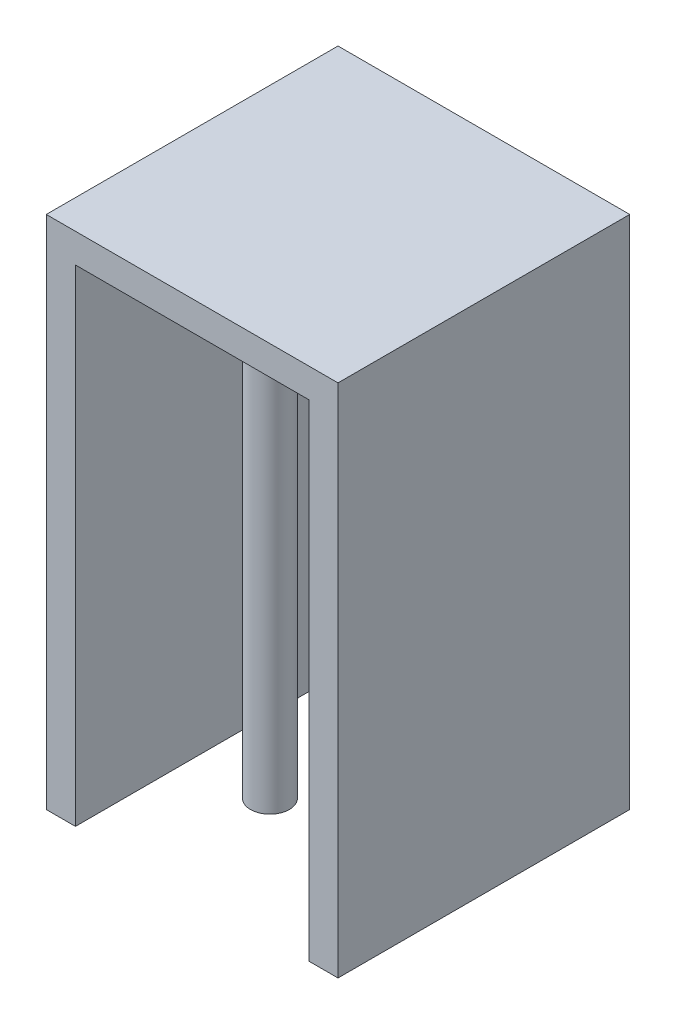
ISO-10303-21;
HEADER;
FILE_DESCRIPTION(('STEP AP214'),'2;1');
FILE_NAME('part.step','',(''),(''),'','','');
FILE_SCHEMA(('AUTOMOTIVE_DESIGN { 1 0 10303 214 1 1 1 1 }'));
ENDSEC;
DATA;
#1=APPLICATION_CONTEXT('core data for automotive mechanical design processes');
#2=APPLICATION_PROTOCOL_DEFINITION('international standard','automotive_design',2000,#1);
#3=PRODUCT_CONTEXT('',#1,'mechanical');
#4=PRODUCT('Part','Part','',(#3));
#5=PRODUCT_RELATED_PRODUCT_CATEGORY('part','',(#4));
#6=PRODUCT_DEFINITION_FORMATION('','',#4);
#7=PRODUCT_DEFINITION_CONTEXT('part definition',#1,'design');
#8=PRODUCT_DEFINITION('design','',#6,#7);
#9=PRODUCT_DEFINITION_SHAPE('','',#8);
#10=(LENGTH_UNIT() NAMED_UNIT(*) SI_UNIT(.MILLI.,.METRE.));
#11=(NAMED_UNIT(*) PLANE_ANGLE_UNIT() SI_UNIT($,.RADIAN.));
#12=(NAMED_UNIT(*) SI_UNIT($,.STERADIAN.) SOLID_ANGLE_UNIT());
#13=UNCERTAINTY_MEASURE_WITH_UNIT(LENGTH_MEASURE(1.E-05),#10,'distance_accuracy_value','');
#14=(GEOMETRIC_REPRESENTATION_CONTEXT(3) GLOBAL_UNCERTAINTY_ASSIGNED_CONTEXT((#13)) GLOBAL_UNIT_ASSIGNED_CONTEXT((#10,
#11,#12)) REPRESENTATION_CONTEXT('',''));
#15=CARTESIAN_POINT('',(0.,0.,0.));
#16=DIRECTION('',(0.,0.,1.));
#17=DIRECTION('',(1.,0.,0.));
#18=AXIS2_PLACEMENT_3D('',#15,#16,#17);
#19=CARTESIAN_POINT('',(0.,-3.,0.));
#20=DIRECTION('',(0.,1.,0.));
#21=DIRECTION('',(0.,0.,1.));
#22=AXIS2_PLACEMENT_3D('',#19,#20,#21);
#23=PLANE('',#22);
#24=CARTESIAN_POINT('',(7.,-3.,0.));
#25=DIRECTION('',(0.,1.,0.));
#26=DIRECTION('',(0.,0.,1.));
#27=AXIS2_PLACEMENT_3D('',#24,#25,#26);
#28=CIRCLE('',#27,2.);
#29=CARTESIAN_POINT('',(7.,-3.,2.));
#30=VERTEX_POINT('',#29);
#31=EDGE_CURVE('E11',#30,#30,#28,.F.);
#32=ORIENTED_EDGE('',*,*,#31,.F.);
#33=EDGE_LOOP('',(#32));
#34=FACE_BOUND('',#33,.T.);
#35=CARTESIAN_POINT('',(-7.,-3.,0.));
#36=DIRECTION('',(0.,1.,0.));
#37=DIRECTION('',(0.,0.,1.));
#38=AXIS2_PLACEMENT_3D('',#35,#36,#37);
#39=CIRCLE('',#38,2.);
#40=CARTESIAN_POINT('',(-7.,-3.,2.));
#41=VERTEX_POINT('',#40);
#42=EDGE_CURVE('E45',#41,#41,#39,.F.);
#43=ORIENTED_EDGE('',*,*,#42,.F.);
#44=EDGE_LOOP('',(#43));
#45=FACE_BOUND('',#44,.T.);
#46=DIRECTION('',(0.,0.,1.));
#47=VECTOR('',#46,1.);
#48=CARTESIAN_POINT('',(-12.,-3.,15.));
#49=LINE('',#48,#47);
#50=CARTESIAN_POINT('',(-12.,-3.,-12.));
#51=VERTEX_POINT('',#50);
#52=CARTESIAN_POINT('',(-12.,-3.,15.));
#53=VERTEX_POINT('',#52);
#54=EDGE_CURVE('E52',#51,#53,#49,.T.);
#55=ORIENTED_EDGE('',*,*,#54,.F.);
#56=DIRECTION('',(-1.,0.,0.));
#57=VECTOR('',#56,1.);
#58=CARTESIAN_POINT('',(-12.,-3.,-12.));
#59=LINE('',#58,#57);
#60=CARTESIAN_POINT('',(12.,-3.,-12.));
#61=VERTEX_POINT('',#60);
#62=EDGE_CURVE('E125',#61,#51,#59,.T.);
#63=ORIENTED_EDGE('',*,*,#62,.F.);
#64=DIRECTION('',(0.,0.,-1.));
#65=VECTOR('',#64,1.);
#66=CARTESIAN_POINT('',(12.,-3.,15.));
#67=LINE('',#66,#65);
#68=CARTESIAN_POINT('',(12.,-3.,15.));
#69=VERTEX_POINT('',#68);
#70=EDGE_CURVE('E57',#69,#61,#67,.T.);
#71=ORIENTED_EDGE('',*,*,#70,.F.);
#72=DIRECTION('',(1.,0.,0.));
#73=VECTOR('',#72,1.);
#74=CARTESIAN_POINT('',(15.,-3.,15.));
#75=LINE('',#74,#73);
#76=EDGE_CURVE('E155',#53,#69,#75,.T.);
#77=ORIENTED_EDGE('',*,*,#76,.F.);
#78=EDGE_LOOP('',(#55,#63,#71,#77));
#79=FACE_BOUND('',#78,.T.);
#80=ADVANCED_FACE('F37',(#34,#45,#79),#23,.F.);
#81=CARTESIAN_POINT('',(-15.,-3.,15.));
#82=DIRECTION('',(-1.,0.,0.));
#83=DIRECTION('',(0.,0.,1.));
#84=AXIS2_PLACEMENT_3D('',#81,#82,#83);
#85=PLANE('',#84);
#86=DIRECTION('',(0.,0.,1.));
#87=VECTOR('',#86,1.);
#88=CARTESIAN_POINT('',(-15.,0.,15.));
#89=LINE('',#88,#87);
#90=CARTESIAN_POINT('',(-15.,0.,-15.));
#91=VERTEX_POINT('',#90);
#92=CARTESIAN_POINT('',(-15.,0.,15.));
#93=VERTEX_POINT('',#92);
#94=EDGE_CURVE('E106',#91,#93,#89,.T.);
#95=ORIENTED_EDGE('',*,*,#94,.F.);
#96=DIRECTION('',(0.,1.,0.));
#97=VECTOR('',#96,1.);
#98=CARTESIAN_POINT('',(-15.,-3.,-15.));
#99=LINE('',#98,#97);
#100=CARTESIAN_POINT('',(-15.,-53.,-15.));
#101=VERTEX_POINT('',#100);
#102=EDGE_CURVE('E101',#101,#91,#99,.T.);
#103=ORIENTED_EDGE('',*,*,#102,.F.);
#104=DIRECTION('',(0.,0.,-1.));
#105=VECTOR('',#104,1.);
#106=CARTESIAN_POINT('',(-15.,-53.,-15.));
#107=LINE('',#106,#105);
#108=CARTESIAN_POINT('',(-15.,-53.,15.));
#109=VERTEX_POINT('',#108);
#110=EDGE_CURVE('E104',#109,#101,#107,.T.);
#111=ORIENTED_EDGE('',*,*,#110,.F.);
#112=DIRECTION('',(0.,1.,0.));
#113=VECTOR('',#112,1.);
#114=CARTESIAN_POINT('',(-15.,-3.,15.));
#115=LINE('',#114,#113);
#116=EDGE_CURVE('E157',#109,#93,#115,.T.);
#117=ORIENTED_EDGE('',*,*,#116,.T.);
#118=EDGE_LOOP('',(#95,#103,#111,#117));
#119=FACE_BOUND('',#118,.T.);
#120=ADVANCED_FACE('F39',(#119),#85,.T.);
#121=CARTESIAN_POINT('',(15.,-3.,-15.));
#122=DIRECTION('',(0.,0.,-1.));
#123=DIRECTION('',(-1.,0.,0.));
#124=AXIS2_PLACEMENT_3D('',#121,#122,#123);
#125=PLANE('',#124);
#126=DIRECTION('',(-1.,0.,0.));
#127=VECTOR('',#126,1.);
#128=CARTESIAN_POINT('',(15.,0.,-15.));
#129=LINE('',#128,#127);
#130=CARTESIAN_POINT('',(15.,0.,-15.));
#131=VERTEX_POINT('',#130);
#132=EDGE_CURVE('E158',#131,#91,#129,.T.);
#133=ORIENTED_EDGE('',*,*,#132,.F.);
#134=DIRECTION('',(0.,1.,0.));
#135=VECTOR('',#134,1.);
#136=CARTESIAN_POINT('',(15.,-3.,-15.));
#137=LINE('',#136,#135);
#138=CARTESIAN_POINT('',(15.,-53.,-15.));
#139=VERTEX_POINT('',#138);
#140=EDGE_CURVE('E110',#139,#131,#137,.T.);
#141=ORIENTED_EDGE('',*,*,#140,.F.);
#142=DIRECTION('',(1.,0.,0.));
#143=VECTOR('',#142,1.);
#144=CARTESIAN_POINT('',(-12.,-53.,-15.));
#145=LINE('',#144,#143);
#146=EDGE_CURVE('E113',#101,#139,#145,.T.);
#147=ORIENTED_EDGE('',*,*,#146,.F.);
#148=ORIENTED_EDGE('',*,*,#102,.T.);
#149=EDGE_LOOP('',(#133,#141,#147,#148));
#150=FACE_BOUND('',#149,.T.);
#151=ADVANCED_FACE('F114',(#150),#125,.T.);
#152=CARTESIAN_POINT('',(15.,-3.,15.));
#153=DIRECTION('',(1.,0.,0.));
#154=DIRECTION('',(0.,0.,-1.));
#155=AXIS2_PLACEMENT_3D('',#152,#153,#154);
#156=PLANE('',#155);
#157=DIRECTION('',(0.,0.,-1.));
#158=VECTOR('',#157,1.);
#159=CARTESIAN_POINT('',(15.,0.,15.));
#160=LINE('',#159,#158);
#161=CARTESIAN_POINT('',(15.,0.,15.));
#162=VERTEX_POINT('',#161);
#163=EDGE_CURVE('E163',#162,#131,#160,.T.);
#164=ORIENTED_EDGE('',*,*,#163,.F.);
#165=DIRECTION('',(0.,1.,0.));
#166=VECTOR('',#165,1.);
#167=CARTESIAN_POINT('',(15.,-3.,15.));
#168=LINE('',#167,#166);
#169=CARTESIAN_POINT('',(15.,-53.,15.));
#170=VERTEX_POINT('',#169);
#171=EDGE_CURVE('E168',#170,#162,#168,.T.);
#172=ORIENTED_EDGE('',*,*,#171,.F.);
#173=DIRECTION('',(0.,0.,1.));
#174=VECTOR('',#173,1.);
#175=CARTESIAN_POINT('',(15.,-53.,-15.));
#176=LINE('',#175,#174);
#177=EDGE_CURVE('E118',#139,#170,#176,.T.);
#178=ORIENTED_EDGE('',*,*,#177,.F.);
#179=ORIENTED_EDGE('',*,*,#140,.T.);
#180=EDGE_LOOP('',(#164,#172,#178,#179));
#181=FACE_BOUND('',#180,.T.);
#182=ADVANCED_FACE('F195',(#181),#156,.T.);
#183=CARTESIAN_POINT('',(15.,-3.,15.));
#184=DIRECTION('',(0.,0.,1.));
#185=DIRECTION('',(1.,0.,0.));
#186=AXIS2_PLACEMENT_3D('',#183,#184,#185);
#187=PLANE('',#186);
#188=DIRECTION('',(1.,0.,0.));
#189=VECTOR('',#188,1.);
#190=CARTESIAN_POINT('',(15.,0.,15.));
#191=LINE('',#190,#189);
#192=EDGE_CURVE('E160',#93,#162,#191,.T.);
#193=ORIENTED_EDGE('',*,*,#192,.F.);
#194=ORIENTED_EDGE('',*,*,#116,.F.);
#195=DIRECTION('',(-1.,0.,0.));
#196=VECTOR('',#195,1.);
#197=CARTESIAN_POINT('',(-15.,-53.,15.));
#198=LINE('',#197,#196);
#199=CARTESIAN_POINT('',(-12.,-53.,15.));
#200=VERTEX_POINT('',#199);
#201=EDGE_CURVE('E123',#200,#109,#198,.T.);
#202=ORIENTED_EDGE('',*,*,#201,.F.);
#203=DIRECTION('',(0.,1.,0.));
#204=VECTOR('',#203,1.);
#205=CARTESIAN_POINT('',(-12.,-53.,15.));
#206=LINE('',#205,#204);
#207=EDGE_CURVE('E141',#200,#53,#206,.T.);
#208=ORIENTED_EDGE('',*,*,#207,.T.);
#209=ORIENTED_EDGE('',*,*,#76,.T.);
#210=DIRECTION('',(0.,1.,0.));
#211=VECTOR('',#210,1.);
#212=CARTESIAN_POINT('',(12.,-53.,15.));
#213=LINE('',#212,#211);
#214=CARTESIAN_POINT('',(12.,-53.,15.));
#215=VERTEX_POINT('',#214);
#216=EDGE_CURVE('E152',#215,#69,#213,.T.);
#217=ORIENTED_EDGE('',*,*,#216,.F.);
#218=DIRECTION('',(-1.,0.,0.));
#219=VECTOR('',#218,1.);
#220=CARTESIAN_POINT('',(15.,-53.,15.));
#221=LINE('',#220,#219);
#222=EDGE_CURVE('E132',#170,#215,#221,.T.);
#223=ORIENTED_EDGE('',*,*,#222,.F.);
#224=ORIENTED_EDGE('',*,*,#171,.T.);
#225=EDGE_LOOP('',(#193,#194,#202,#208,#209,#217,#223,#224));
#226=FACE_BOUND('',#225,.T.);
#227=ADVANCED_FACE('F191',(#226),#187,.T.);
#228=CARTESIAN_POINT('',(0.,0.,0.));
#229=DIRECTION('',(0.,1.,0.));
#230=DIRECTION('',(0.,0.,1.));
#231=AXIS2_PLACEMENT_3D('',#228,#229,#230);
#232=PLANE('',#231);
#233=ORIENTED_EDGE('',*,*,#94,.T.);
#234=ORIENTED_EDGE('',*,*,#192,.T.);
#235=ORIENTED_EDGE('',*,*,#163,.T.);
#236=ORIENTED_EDGE('',*,*,#132,.T.);
#237=EDGE_LOOP('',(#233,#234,#235,#236));
#238=FACE_BOUND('',#237,.T.);
#239=ADVANCED_FACE('F188',(#238),#232,.T.);
#240=CARTESIAN_POINT('',(12.,-53.,15.));
#241=DIRECTION('',(1.,0.,0.));
#242=DIRECTION('',(0.,0.,-1.));
#243=AXIS2_PLACEMENT_3D('',#240,#241,#242);
#244=PLANE('',#243);
#245=ORIENTED_EDGE('',*,*,#70,.T.);
#246=DIRECTION('',(0.,1.,0.));
#247=VECTOR('',#246,1.);
#248=CARTESIAN_POINT('',(12.,-53.,-12.));
#249=LINE('',#248,#247);
#250=CARTESIAN_POINT('',(12.,-53.,-12.));
#251=VERTEX_POINT('',#250);
#252=EDGE_CURVE('E149',#251,#61,#249,.T.);
#253=ORIENTED_EDGE('',*,*,#252,.F.);
#254=DIRECTION('',(0.,0.,-1.));
#255=VECTOR('',#254,1.);
#256=CARTESIAN_POINT('',(12.,-53.,15.));
#257=LINE('',#256,#255);
#258=EDGE_CURVE('E134',#215,#251,#257,.T.);
#259=ORIENTED_EDGE('',*,*,#258,.F.);
#260=ORIENTED_EDGE('',*,*,#216,.T.);
#261=EDGE_LOOP('',(#245,#253,#259,#260));
#262=FACE_BOUND('',#261,.T.);
#263=ADVANCED_FACE('F186',(#262),#244,.F.);
#264=CARTESIAN_POINT('',(-12.,-53.,-12.));
#265=DIRECTION('',(0.,0.,-1.));
#266=DIRECTION('',(-1.,0.,0.));
#267=AXIS2_PLACEMENT_3D('',#264,#265,#266);
#268=PLANE('',#267);
#269=ORIENTED_EDGE('',*,*,#62,.T.);
#270=DIRECTION('',(0.,1.,0.));
#271=VECTOR('',#270,1.);
#272=CARTESIAN_POINT('',(-12.,-53.,-12.));
#273=LINE('',#272,#271);
#274=CARTESIAN_POINT('',(-12.,-53.,-12.));
#275=VERTEX_POINT('',#274);
#276=EDGE_CURVE('E146',#275,#51,#273,.T.);
#277=ORIENTED_EDGE('',*,*,#276,.F.);
#278=DIRECTION('',(-1.,0.,0.));
#279=VECTOR('',#278,1.);
#280=CARTESIAN_POINT('',(-12.,-53.,-12.));
#281=LINE('',#280,#279);
#282=EDGE_CURVE('E136',#251,#275,#281,.T.);
#283=ORIENTED_EDGE('',*,*,#282,.F.);
#284=ORIENTED_EDGE('',*,*,#252,.T.);
#285=EDGE_LOOP('',(#269,#277,#283,#284));
#286=FACE_BOUND('',#285,.T.);
#287=ADVANCED_FACE('F214',(#286),#268,.F.);
#288=CARTESIAN_POINT('',(-12.,-53.,15.));
#289=DIRECTION('',(-1.,0.,0.));
#290=DIRECTION('',(0.,0.,1.));
#291=AXIS2_PLACEMENT_3D('',#288,#289,#290);
#292=PLANE('',#291);
#293=ORIENTED_EDGE('',*,*,#54,.T.);
#294=ORIENTED_EDGE('',*,*,#207,.F.);
#295=DIRECTION('',(0.,0.,1.));
#296=VECTOR('',#295,1.);
#297=CARTESIAN_POINT('',(-12.,-53.,15.));
#298=LINE('',#297,#296);
#299=EDGE_CURVE('E138',#275,#200,#298,.T.);
#300=ORIENTED_EDGE('',*,*,#299,.F.);
#301=ORIENTED_EDGE('',*,*,#276,.T.);
#302=EDGE_LOOP('',(#293,#294,#300,#301));
#303=FACE_BOUND('',#302,.T.);
#304=ADVANCED_FACE('F216',(#303),#292,.F.);
#305=CARTESIAN_POINT('',(0.,-53.,0.));
#306=DIRECTION('',(0.,1.,0.));
#307=DIRECTION('',(0.,0.,1.));
#308=AXIS2_PLACEMENT_3D('',#305,#306,#307);
#309=PLANE('',#308);
#310=ORIENTED_EDGE('',*,*,#110,.T.);
#311=ORIENTED_EDGE('',*,*,#146,.T.);
#312=ORIENTED_EDGE('',*,*,#177,.T.);
#313=ORIENTED_EDGE('',*,*,#222,.T.);
#314=ORIENTED_EDGE('',*,*,#258,.T.);
#315=ORIENTED_EDGE('',*,*,#282,.T.);
#316=ORIENTED_EDGE('',*,*,#299,.T.);
#317=ORIENTED_EDGE('',*,*,#201,.T.);
#318=EDGE_LOOP('',(#310,#311,#312,#313,#314,#315,#316,#317));
#319=FACE_BOUND('',#318,.T.);
#320=ADVANCED_FACE('F121',(#319),#309,.F.);
#321=CARTESIAN_POINT('',(-7.,-55.5,0.));
#322=DIRECTION('',(0.,1.,0.));
#323=DIRECTION('',(0.,0.,1.));
#324=AXIS2_PLACEMENT_3D('',#321,#322,#323);
#325=CYLINDRICAL_SURFACE('',#324,2.);
#326=CARTESIAN_POINT('',(-7.,-55.5,0.));
#327=DIRECTION('',(0.,-1.,0.));
#328=DIRECTION('',(0.,0.,-1.));
#329=AXIS2_PLACEMENT_3D('',#326,#327,#328);
#330=CIRCLE('',#329,2.);
#331=CARTESIAN_POINT('',(-7.,-55.5,-2.));
#332=VERTEX_POINT('',#331);
#333=EDGE_CURVE('E128',#332,#332,#330,.T.);
#334=ORIENTED_EDGE('',*,*,#333,.F.);
#335=EDGE_LOOP('',(#334));
#336=FACE_BOUND('',#335,.T.);
#337=ORIENTED_EDGE('',*,*,#42,.T.);
#338=EDGE_LOOP('',(#337));
#339=FACE_BOUND('',#338,.T.);
#340=ADVANCED_FACE('F173',(#336,#339),#325,.T.);
#341=CARTESIAN_POINT('',(-7.,-55.5,0.));
#342=DIRECTION('',(0.,-1.,0.));
#343=DIRECTION('',(0.,0.,-1.));
#344=AXIS2_PLACEMENT_3D('',#341,#342,#343);
#345=PLANE('',#344);
#346=ORIENTED_EDGE('',*,*,#333,.T.);
#347=EDGE_LOOP('',(#346));
#348=FACE_BOUND('',#347,.T.);
#349=ADVANCED_FACE('F227',(#348),#345,.T.);
#350=CARTESIAN_POINT('',(7.,-55.5,0.));
#351=DIRECTION('',(0.,1.,0.));
#352=DIRECTION('',(0.,0.,1.));
#353=AXIS2_PLACEMENT_3D('',#350,#351,#352);
#354=CYLINDRICAL_SURFACE('',#353,2.);
#355=CARTESIAN_POINT('',(7.,-55.5,0.));
#356=DIRECTION('',(0.,-1.,0.));
#357=DIRECTION('',(0.,0.,-1.));
#358=AXIS2_PLACEMENT_3D('',#355,#356,#357);
#359=CIRCLE('',#358,2.);
#360=CARTESIAN_POINT('',(7.,-55.5,-2.));
#361=VERTEX_POINT('',#360);
#362=EDGE_CURVE('E243',#361,#361,#359,.T.);
#363=ORIENTED_EDGE('',*,*,#362,.F.);
#364=EDGE_LOOP('',(#363));
#365=FACE_BOUND('',#364,.T.);
#366=ORIENTED_EDGE('',*,*,#31,.T.);
#367=EDGE_LOOP('',(#366));
#368=FACE_BOUND('',#367,.T.);
#369=ADVANCED_FACE('F231',(#365,#368),#354,.T.);
#370=CARTESIAN_POINT('',(7.,-55.5,0.));
#371=DIRECTION('',(0.,-1.,0.));
#372=DIRECTION('',(0.,0.,-1.));
#373=AXIS2_PLACEMENT_3D('',#370,#371,#372);
#374=PLANE('',#373);
#375=ORIENTED_EDGE('',*,*,#362,.T.);
#376=EDGE_LOOP('',(#375));
#377=FACE_BOUND('',#376,.T.);
#378=ADVANCED_FACE('F235',(#377),#374,.T.);
#379=CLOSED_SHELL('',(#80,#120,#151,#182,#227,#239,#263,#287,#304,#320,#340,#349,#369,#378));
#380=MANIFOLD_SOLID_BREP('B2',#379);
#381=ADVANCED_BREP_SHAPE_REPRESENTATION('',(#18,#380),#14);
#382=SHAPE_DEFINITION_REPRESENTATION(#9,#381);
ENDSEC;
END-ISO-10303-21;
